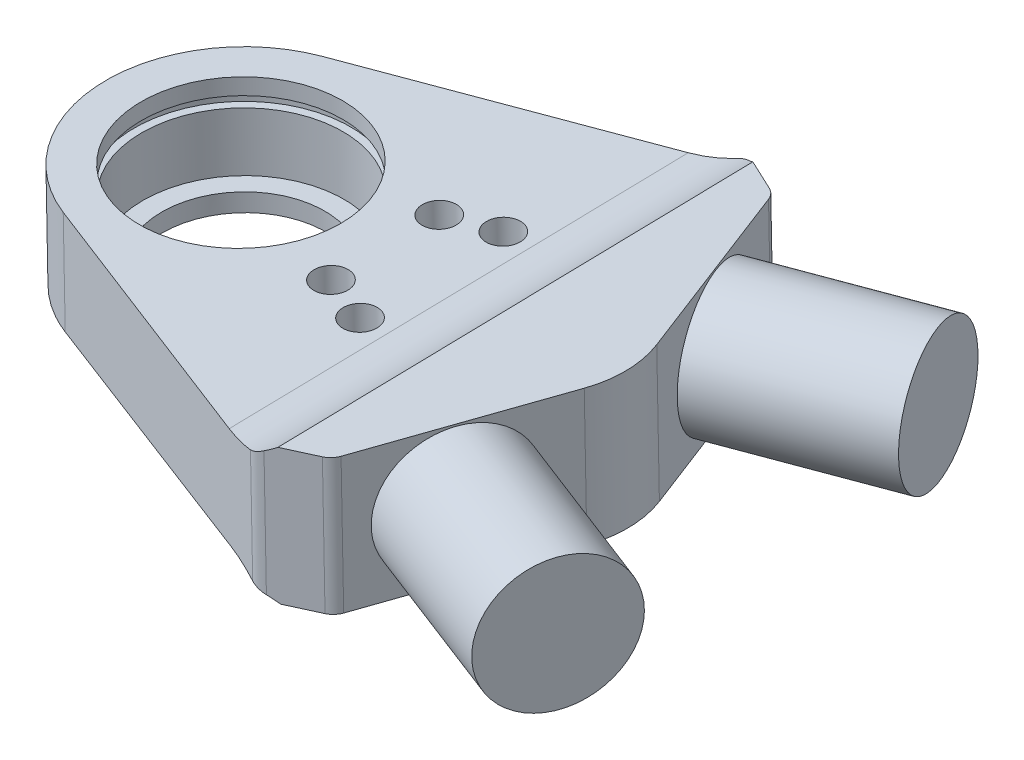
ISO-10303-21;
HEADER;
FILE_DESCRIPTION(('STEP AP214'),'2;1');
FILE_NAME('part.step','',(''),(''),'','','');
FILE_SCHEMA(('AUTOMOTIVE_DESIGN { 1 0 10303 214 1 1 1 1 }'));
ENDSEC;
DATA;
#1=APPLICATION_CONTEXT('core data for automotive mechanical design processes');
#2=APPLICATION_PROTOCOL_DEFINITION('international standard','automotive_design',2000,#1);
#3=PRODUCT_CONTEXT('',#1,'mechanical');
#4=PRODUCT('Part','Part','',(#3));
#5=PRODUCT_RELATED_PRODUCT_CATEGORY('part','',(#4));
#6=PRODUCT_DEFINITION_FORMATION('','',#4);
#7=PRODUCT_DEFINITION_CONTEXT('part definition',#1,'design');
#8=PRODUCT_DEFINITION('design','',#6,#7);
#9=PRODUCT_DEFINITION_SHAPE('','',#8);
#10=(LENGTH_UNIT() NAMED_UNIT(*) SI_UNIT(.MILLI.,.METRE.));
#11=(NAMED_UNIT(*) PLANE_ANGLE_UNIT() SI_UNIT($,.RADIAN.));
#12=(NAMED_UNIT(*) SI_UNIT($,.STERADIAN.) SOLID_ANGLE_UNIT());
#13=UNCERTAINTY_MEASURE_WITH_UNIT(LENGTH_MEASURE(1.E-05),#10,'distance_accuracy_value','');
#14=(GEOMETRIC_REPRESENTATION_CONTEXT(3) GLOBAL_UNCERTAINTY_ASSIGNED_CONTEXT((#13)) GLOBAL_UNIT_ASSIGNED_CONTEXT((#10,
#11,#12)) REPRESENTATION_CONTEXT('',''));
#15=CARTESIAN_POINT('',(0.,0.,0.));
#16=DIRECTION('',(0.,0.,1.));
#17=DIRECTION('',(1.,0.,0.));
#18=AXIS2_PLACEMENT_3D('',#15,#16,#17);
#19=CARTESIAN_POINT('',(-585.53416326074,112.85200121076,771.01929436932));
#20=DIRECTION('',(0.00538004106138572,0.999684848699186,0.024520571760546));
#21=DIRECTION('',(0.,-0.0245209266402855,0.99969931687318));
#22=AXIS2_PLACEMENT_3D('',#19,#20,#21);
#23=CYLINDRICAL_SURFACE('',#22,12.7000000000001);
#24=CARTESIAN_POINT('',(-585.526357552896,114.30240795966,771.054870383916));
#25=DIRECTION('',(0.,0.999699820798355,0.0245003733795452));
#26=DIRECTION('',(0.999992698636837,-9.36243645926273E-05,0.00382019731105017));
#27=AXIS2_PLACEMENT_3D('',#24,#25,#26);
#28=ELLIPSE('',#27,12.7001838064199,12.7000000000001);
#29=CARTESIAN_POINT('',(-590.008326790914,114.011273288213,782.934170113944));
#30=VERTEX_POINT('',#29);
#31=CARTESIAN_POINT('',(-589.917379504176,114.594373365334,759.141673829315));
#32=VERTEX_POINT('',#31);
#33=EDGE_CURVE('E207',#30,#32,#28,.F.);
#34=ORIENTED_EDGE('',*,*,#33,.F.);
#35=DIRECTION('',(0.00538004106138572,0.999684848699186,0.024520571760546));
#36=VECTOR('',#35,1.);
#37=CARTESIAN_POINT('',(-590.016004083219,112.584727894023,782.89917937786));
#38=LINE('',#37,#36);
#39=CARTESIAN_POINT('',(-589.956218253315,123.693748743422,783.171664794921));
#40=VERTEX_POINT('',#39);
#41=EDGE_CURVE('E200',#30,#40,#38,.T.);
#42=ORIENTED_EDGE('',*,*,#41,.T.);
#43=CARTESIAN_POINT('',(-585.474377430836,123.961022060159,771.291779786381));
#44=DIRECTION('',(-0.00538004106137596,-0.999684848699186,-0.0245205717605447));
#45=DIRECTION('',(0.,0.0245209266402842,-0.999699316873179));
#46=AXIS2_PLACEMENT_3D('',#43,#44,#45);
#47=CIRCLE('',#46,12.7000000000001);
#48=CARTESIAN_POINT('',(-589.865270966578,124.276848820543,759.379168510292));
#49=VERTEX_POINT('',#48);
#50=EDGE_CURVE('E181',#49,#40,#47,.F.);
#51=ORIENTED_EDGE('',*,*,#50,.F.);
#52=DIRECTION('',(0.00538004106138572,0.999684848699186,0.024520571760546));
#53=VECTOR('',#52,1.);
#54=CARTESIAN_POINT('',(-589.925056796482,113.167827971144,759.106683093231));
#55=LINE('',#54,#53);
#56=EDGE_CURVE('E208',#32,#49,#55,.T.);
#57=ORIENTED_EDGE('',*,*,#56,.F.);
#58=EDGE_LOOP('',(#34,#42,#51,#57));
#59=FACE_BOUND('',#58,.T.);
#60=ADVANCED_FACE('F64',(#59),#23,.T.);
#61=CARTESIAN_POINT('',(-557.961210133809,113.284714048954,747.328162944679));
#62=DIRECTION('',(-0.3457396484836,0.0248682488491075,-0.938000887881038));
#63=DIRECTION('',(-0.938291066330358,0.,0.345846605946393));
#64=AXIS2_PLACEMENT_3D('',#61,#62,#63);
#65=PLANE('',#64);
#66=CARTESIAN_POINT('',(-565.207646644979,133.888828138748,750.545397264626));
#67=DIRECTION('',(-0.3457396484836,0.0248682488491075,-0.938000887881038));
#68=DIRECTION('',(-0.938315059361521,-0.00343125056869183,0.34576448038357));
#69=AXIS2_PLACEMENT_3D('',#66,#67,#68);
#70=ELLIPSE('',#69,10.1654154875738,9.525);
#71=CARTESIAN_POINT('',(-565.258891536089,124.366829954888,750.311838818607));
#72=VERTEX_POINT('',#71);
#73=CARTESIAN_POINT('',(-562.090502636833,124.918059449398,749.158610110594));
#74=VERTEX_POINT('',#73);
#75=EDGE_CURVE('E245',#72,#74,#70,.F.);
#76=ORIENTED_EDGE('',*,*,#75,.T.);
#77=DIRECTION('',(0.00538004106138572,0.999684848699186,0.0245205717605461));
#78=VECTOR('',#77,1.);
#79=CARTESIAN_POINT('',(-562.153192742071,113.269384717334,748.872887900185));
#80=LINE('',#79,#78);
#81=CARTESIAN_POINT('',(-562.147627690845,114.303446972478,748.898251691349));
#82=VERTEX_POINT('',#81);
#83=EDGE_CURVE('E278',#74,#82,#80,.F.);
#84=ORIENTED_EDGE('',*,*,#83,.T.);
#85=CARTESIAN_POINT('',(-565.318727304473,105.294764034744,749.828255818098));
#86=DIRECTION('',(-0.3457396484836,0.0248682488491075,-0.938000887881038));
#87=DIRECTION('',(-0.938315059361521,-0.00343125056869183,0.34576448038357));
#88=AXIS2_PLACEMENT_3D('',#85,#86,#87);
#89=ELLIPSE('',#88,10.1654154875738,9.525);
#90=CARTESIAN_POINT('',(-565.31880031127,114.816436751554,750.080721003351));
#91=VERTEX_POINT('',#90);
#92=EDGE_CURVE('E241',#82,#91,#89,.F.);
#93=ORIENTED_EDGE('',*,*,#92,.T.);
#94=DIRECTION('',(0.938330258086945,0.00847076544014602,-0.345636475059195));
#95=VECTOR('',#94,1.);
#96=CARTESIAN_POINT('',(-557.960171314262,114.882866688836,747.370150214576));
#97=LINE('',#96,#95);
#98=EDGE_CURVE('E418',#32,#91,#97,.T.);
#99=ORIENTED_EDGE('',*,*,#98,.F.);
#100=ORIENTED_EDGE('',*,*,#56,.T.);
#101=DIRECTION('',(-0.938315059361521,-0.0034312505687005,0.34576448038357));
#102=VECTOR('',#101,1.);
#103=CARTESIAN_POINT('',(-557.901424303906,124.393734898353,747.60064836174));
#104=LINE('',#103,#102);
#105=EDGE_CURVE('E189',#72,#49,#104,.T.);
#106=ORIENTED_EDGE('',*,*,#105,.F.);
#107=EDGE_LOOP('',(#76,#84,#93,#99,#100,#106));
#108=FACE_BOUND('',#107,.T.);
#109=ADVANCED_FACE('F353',(#108),#65,.T.);
#110=CARTESIAN_POINT('',(-549.179423062326,112.653060528187,771.153385496858));
#111=DIRECTION('',(0.938315059361519,0.00343125056869194,-0.345764480383574));
#112=DIRECTION('',(-0.345766515827225,0.,-0.938320583027305));
#113=AXIS2_PLACEMENT_3D('',#110,#111,#112);
#114=PLANE('',#113);
#115=CARTESIAN_POINT('',(-553.536153337328,119.31688607781,759.396479851448));
#116=DIRECTION('',(0.93831505936152,0.00343125056869194,-0.345764480383574));
#117=DIRECTION('',(-0.345766515827225,0.,-0.938320583027305));
#118=AXIS2_PLACEMENT_3D('',#115,#116,#117);
#119=CIRCLE('',#118,6.17219999999994);
#120=CARTESIAN_POINT('',(-555.670293426316,119.31688607781,753.604977548887));
#121=VERTEX_POINT('',#120);
#122=EDGE_CURVE('E235',#121,#121,#119,.T.);
#123=ORIENTED_EDGE('',*,*,#122,.F.);
#124=EDGE_LOOP('',(#123));
#125=FACE_BOUND('',#124,.T.);
#126=DIRECTION('',(-0.345739648483604,0.0248682488491073,-0.938000887881037));
#127=VECTOR('',#126,1.);
#128=CARTESIAN_POINT('',(-549.179423062326,112.653060528187,771.153385496858));
#129=LINE('',#128,#127);
#130=CARTESIAN_POINT('',(-550.40716626778,112.741369241665,767.822485434174));
#131=VERTEX_POINT('',#130);
#132=CARTESIAN_POINT('',(-556.416596116406,113.1736135549,751.518741971736));
#133=VERTEX_POINT('',#132);
#134=EDGE_CURVE('E209',#131,#133,#129,.T.);
#135=ORIENTED_EDGE('',*,*,#134,.T.);
#136=DIRECTION('',(-0.00538004106138572,-0.999684848699186,-0.0245205717605461));
#137=VECTOR('',#136,1.);
#138=CARTESIAN_POINT('',(-556.416596116406,113.1736135549,751.518741971736));
#139=LINE('',#138,#137);
#140=CARTESIAN_POINT('',(-556.348269594927,125.86961113338,751.830153233095));
#141=VERTEX_POINT('',#140);
#142=EDGE_CURVE('E12',#133,#141,#139,.F.);
#143=ORIENTED_EDGE('',*,*,#142,.T.);
#144=DIRECTION('',(-0.345739648483604,0.0248682488491073,-0.938000887881037));
#145=VECTOR('',#144,1.);
#146=CARTESIAN_POINT('',(-549.111096540846,125.349058106666,771.464796758217));
#147=LINE('',#146,#145);
#148=CARTESIAN_POINT('',(-550.338839746301,125.437366820145,768.133896695533));
#149=VERTEX_POINT('',#148);
#150=EDGE_CURVE('E392',#149,#141,#147,.T.);
#151=ORIENTED_EDGE('',*,*,#150,.F.);
#152=DIRECTION('',(0.00538004106138572,0.999684848699186,0.0245205717605461));
#153=VECTOR('',#152,1.);
#154=CARTESIAN_POINT('',(-550.40716626778,112.741369241665,767.822485434174));
#155=LINE('',#154,#153);
#156=EDGE_CURVE('E273',#149,#131,#155,.F.);
#157=ORIENTED_EDGE('',*,*,#156,.T.);
#158=EDGE_LOOP('',(#135,#143,#151,#157));
#159=FACE_BOUND('',#158,.T.);
#160=ADVANCED_FACE('F359',(#125,#159),#114,.T.);
#161=CARTESIAN_POINT('',(-558.143104707284,112.118513894713,794.913155513937));
#162=DIRECTION('',(0.935645255265212,-0.0136859502879864,0.352676411267341));
#163=DIRECTION('',(0.35270944497705,0.,-0.935732893204028));
#164=AXIS2_PLACEMENT_3D('',#161,#162,#163);
#165=PLANE('',#164);
#166=CARTESIAN_POINT('',(-553.627100624065,118.73378600069,783.188976136077));
#167=DIRECTION('',(0.935645255265212,-0.0136859502879864,0.352676411267341));
#168=DIRECTION('',(0.35270944497705,0.,-0.935732893204028));
#169=AXIS2_PLACEMENT_3D('',#166,#167,#168);
#170=CIRCLE('',#169,6.17219999999997);
#171=CARTESIAN_POINT('',(-551.450107387778,118.73378600069,777.413445572643));
#172=VERTEX_POINT('',#171);
#173=EDGE_CURVE('E211',#172,#172,#170,.T.);
#174=ORIENTED_EDGE('',*,*,#173,.F.);
#175=EDGE_LOOP('',(#174));
#176=FACE_BOUND('',#175,.T.);
#177=DIRECTION('',(0.352900852163712,0.0210451430501451,-0.935424016420428));
#178=VECTOR('',#177,1.);
#179=CARTESIAN_POINT('',(-558.074778185804,124.814511473193,795.224566775296));
#180=LINE('',#179,#178);
#181=CARTESIAN_POINT('',(-556.498171032427,124.908531997295,791.045500086488));
#182=VERTEX_POINT('',#181);
#183=CARTESIAN_POINT('',(-550.364269630318,125.274325481985,774.786546188507));
#184=VERTEX_POINT('',#183);
#185=EDGE_CURVE('E219',#182,#184,#180,.T.);
#186=ORIENTED_EDGE('',*,*,#185,.F.);
#187=DIRECTION('',(0.00538004106138572,0.999684848699186,0.0245205717605461));
#188=VECTOR('',#187,1.);
#189=CARTESIAN_POINT('',(-556.566497553907,112.212534418816,790.734088825129));
#190=LINE('',#189,#188);
#191=CARTESIAN_POINT('',(-556.566497553907,112.212534418816,790.734088825129));
#192=VERTEX_POINT('',#191);
#193=EDGE_CURVE('E727',#182,#192,#190,.F.);
#194=ORIENTED_EDGE('',*,*,#193,.T.);
#195=DIRECTION('',(0.352900852163712,0.0210451430501451,-0.935424016420428));
#196=VECTOR('',#195,1.);
#197=CARTESIAN_POINT('',(-558.143104707284,112.118513894713,794.913155513937));
#198=LINE('',#197,#196);
#199=CARTESIAN_POINT('',(-550.432596151798,112.578327903505,774.475134927149));
#200=VERTEX_POINT('',#199);
#201=EDGE_CURVE('E213',#192,#200,#198,.T.);
#202=ORIENTED_EDGE('',*,*,#201,.T.);
#203=DIRECTION('',(0.00538004106138572,0.999684848699186,0.0245205717605461));
#204=VECTOR('',#203,1.);
#205=CARTESIAN_POINT('',(-550.432596151798,112.578327903505,774.475134927149));
#206=LINE('',#205,#204);
#207=EDGE_CURVE('E268',#200,#184,#206,.T.);
#208=ORIENTED_EDGE('',*,*,#207,.T.);
#209=EDGE_LOOP('',(#186,#194,#202,#208));
#210=FACE_BOUND('',#209,.T.);
#211=ADVANCED_FACE('F365',(#176,#210),#165,.T.);
#212=CARTESIAN_POINT('',(-590.016004083219,112.584727894023,782.89917937786));
#213=DIRECTION('',(-0.352900852163713,-0.0210451430501446,0.935424016420427));
#214=DIRECTION('',(0.935631233989688,0.,0.352979027681437));
#215=AXIS2_PLACEMENT_3D('',#212,#213,#214);
#216=PLANE('',#215);
#217=CARTESIAN_POINT('',(-565.479809345375,104.26200149897,791.968532863944));
#218=DIRECTION('',(-0.352900852163713,-0.0210451430501446,0.935424016420427));
#219=DIRECTION('',(0.935645255265212,-0.0136859502879864,0.352676411267343));
#220=AXIS2_PLACEMENT_3D('',#217,#218,#219);
#221=ELLIPSE('',#220,10.1654154875739,9.525);
#222=CARTESIAN_POINT('',(-565.479736338578,113.784610368368,792.182799791572));
#223=VERTEX_POINT('',#222);
#224=CARTESIAN_POINT('',(-562.317594743571,113.213719009083,793.362914855799));
#225=VERTEX_POINT('',#224);
#226=EDGE_CURVE('E243',#223,#225,#221,.F.);
#227=ORIENTED_EDGE('',*,*,#226,.T.);
#228=DIRECTION('',(-0.00538004106138572,-0.999684848699186,-0.0245205717605461));
#229=VECTOR('',#228,1.);
#230=CARTESIAN_POINT('',(-562.323159794797,112.17965675394,793.337551064635));
#231=LINE('',#230,#229);
#232=CARTESIAN_POINT('',(-562.26046968956,123.828331486004,793.623273275044));
#233=VERTEX_POINT('',#232);
#234=EDGE_CURVE('E330',#225,#233,#231,.F.);
#235=ORIENTED_EDGE('',*,*,#234,.T.);
#236=CARTESIAN_POINT('',(-565.368606889457,132.856846489425,792.653811447264));
#237=DIRECTION('',(-0.352900852163713,-0.0210451430501446,0.935424016420427));
#238=DIRECTION('',(0.935645255265212,-0.0136859502879864,0.352676411267343));
#239=AXIS2_PLACEMENT_3D('',#236,#237,#238);
#240=ELLIPSE('',#239,10.1654154875739,9.525);
#241=CARTESIAN_POINT('',(-565.419851780567,123.334848305565,792.420253001245));
#242=VERTEX_POINT('',#241);
#243=EDGE_CURVE('E203',#233,#242,#240,.F.);
#244=ORIENTED_EDGE('',*,*,#243,.T.);
#245=DIRECTION('',(0.935645255265212,-0.0136859502879768,0.352676411267343));
#246=VECTOR('',#245,1.);
#247=CARTESIAN_POINT('',(-589.956218253316,123.693748743422,783.171664794921));
#248=LINE('',#247,#246);
#249=EDGE_CURVE('E186',#40,#242,#248,.T.);
#250=ORIENTED_EDGE('',*,*,#249,.F.);
#251=ORIENTED_EDGE('',*,*,#41,.F.);
#252=DIRECTION('',(-0.935660487914937,0.00864621791402423,-0.352795541738505));
#253=VECTOR('',#252,1.);
#254=CARTESIAN_POINT('',(-590.015057644668,114.011335486446,782.931632211331));
#255=LINE('',#254,#253);
#256=EDGE_CURVE('E234',#223,#30,#255,.T.);
#257=ORIENTED_EDGE('',*,*,#256,.F.);
#258=EDGE_LOOP('',(#227,#235,#244,#250,#251,#257));
#259=FACE_BOUND('',#258,.T.);
#260=ADVANCED_FACE('F198',(#259),#216,.T.);
#261=CARTESIAN_POINT('',(-585.53416326074,112.85200121076,771.01929436932));
#262=DIRECTION('',(0.00538004106138572,0.999684848699186,0.0245205717605461));
#263=DIRECTION('',(0.,-0.0245209266402855,0.99969931687318));
#264=AXIS2_PLACEMENT_3D('',#261,#262,#263);
#265=PLANE('',#264);
#266=ORIENTED_EDGE('',*,*,#201,.F.);
#267=CARTESIAN_POINT('',(-558.05183439664,112.234260864898,790.174215022242));
#268=DIRECTION('',(0.00538004106138572,0.999684848699186,0.0245205717605461));
#269=DIRECTION('',(0.,-0.0245209266402855,0.99969931687318));
#270=AXIS2_PLACEMENT_3D('',#267,#268,#269);
#271=CIRCLE('',#270,1.5875);
#272=CARTESIAN_POINT('',(-557.397685147519,112.195274100705,791.620148991029));
#273=VERTEX_POINT('',#272);
#274=EDGE_CURVE('E386',#192,#273,#271,.F.);
#275=ORIENTED_EDGE('',*,*,#274,.T.);
#276=DIRECTION('',(0.911139690434511,0.00520373510618165,-0.412064783323991));
#277=VECTOR('',#276,1.);
#278=CARTESIAN_POINT('',(-561.707913129844,112.17065736531,793.569458387008));
#279=LINE('',#278,#277);
#280=CARTESIAN_POINT('',(-560.217428581383,112.179169876456,792.895383710032));
#281=VERTEX_POINT('',#280);
#282=EDGE_CURVE('E261',#273,#281,#279,.F.);
#283=ORIENTED_EDGE('',*,*,#282,.T.);
#284=DIRECTION('',(0.00382134439891516,0.0245001944934228,-0.99969252162691));
#285=VECTOR('',#284,1.);
#286=CARTESIAN_POINT('',(-560.134164912947,112.713007148883,771.112979935475));
#287=LINE('',#286,#285);
#288=CARTESIAN_POINT('',(-560.050901244511,113.24684442131,749.330576160918));
#289=VERTEX_POINT('',#288);
#290=EDGE_CURVE('E231',#281,#289,#287,.T.);
#291=ORIENTED_EDGE('',*,*,#290,.T.);
#292=DIRECTION('',(-0.907963791331784,0.0151582468523668,-0.418774379807044));
#293=VECTOR('',#292,1.);
#294=CARTESIAN_POINT('',(-556.643942073087,113.189966020839,750.901946327506));
#295=LINE('',#294,#293);
#296=CARTESIAN_POINT('',(-557.240986403051,113.199933538731,750.626575358548));
#297=VERTEX_POINT('',#296);
#298=EDGE_CURVE('E259',#289,#297,#295,.F.);
#299=ORIENTED_EDGE('',*,*,#298,.T.);
#300=CARTESIAN_POINT('',(-557.906171273143,113.168166444622,752.067643084345));
#301=DIRECTION('',(0.00538004106138572,0.999684848699186,0.0245205717605461));
#302=DIRECTION('',(0.,-0.0245209266402855,0.99969931687318));
#303=AXIS2_PLACEMENT_3D('',#300,#301,#302);
#304=CIRCLE('',#303,1.5875);
#305=EDGE_CURVE('E88',#297,#133,#304,.F.);
#306=ORIENTED_EDGE('',*,*,#305,.T.);
#307=ORIENTED_EDGE('',*,*,#134,.F.);
#308=CARTESIAN_POINT('',(-559.344617208199,112.708686579998,771.115892109827));
#309=DIRECTION('',(0.00538004106138572,0.999684848699186,0.0245205717605461));
#310=DIRECTION('',(0.,-0.0245209266402855,0.99969931687318));
#311=AXIS2_PLACEMENT_3D('',#308,#309,#310);
#312=CIRCLE('',#311,9.525);
#313=EDGE_CURVE('E275',#131,#200,#312,.F.);
#314=ORIENTED_EDGE('',*,*,#313,.T.);
#315=EDGE_LOOP('',(#266,#275,#283,#291,#299,#306,#307,#314));
#316=FACE_BOUND('',#315,.T.);
#317=ADVANCED_FACE('F369',(#316),#265,.F.);
#318=CARTESIAN_POINT('',(-585.46583673926,125.54799878924,771.330705630679));
#319=DIRECTION('',(0.00538004106138572,0.999684848699186,0.0245205717605461));
#320=DIRECTION('',(0.,-0.0245209266402855,0.99969931687318));
#321=AXIS2_PLACEMENT_3D('',#318,#319,#320);
#322=PLANE('',#321);
#323=DIRECTION('',(-0.911139690434511,-0.00520373510618165,0.412064783323991));
#324=VECTOR('',#323,1.);
#325=CARTESIAN_POINT('',(-572.949899054353,124.802059063976,798.995981520138));
#326=LINE('',#325,#324);
#327=CARTESIAN_POINT('',(-560.149102059903,124.875167454936,793.206794971391));
#328=VERTEX_POINT('',#327);
#329=CARTESIAN_POINT('',(-557.329358626039,124.891271679185,791.931560252388));
#330=VERTEX_POINT('',#329);
#331=EDGE_CURVE('E256',#328,#330,#326,.F.);
#332=ORIENTED_EDGE('',*,*,#331,.T.);
#333=CARTESIAN_POINT('',(-557.983507875161,124.930258443377,790.485626283601));
#334=DIRECTION('',(0.00538004106138572,0.999684848699186,0.0245205717605461));
#335=DIRECTION('',(0.,-0.0245209266402855,0.99969931687318));
#336=AXIS2_PLACEMENT_3D('',#333,#334,#335);
#337=CIRCLE('',#336,1.5875);
#338=EDGE_CURVE('E73',#330,#182,#337,.T.);
#339=ORIENTED_EDGE('',*,*,#338,.T.);
#340=ORIENTED_EDGE('',*,*,#185,.T.);
#341=CARTESIAN_POINT('',(-559.276290686719,125.404684158478,771.427303371186));
#342=DIRECTION('',(0.00538004106138572,0.999684848699186,0.0245205717605461));
#343=DIRECTION('',(0.,-0.0245209266402855,0.99969931687318));
#344=AXIS2_PLACEMENT_3D('',#341,#342,#343);
#345=CIRCLE('',#344,9.525);
#346=EDGE_CURVE('E271',#184,#149,#345,.T.);
#347=ORIENTED_EDGE('',*,*,#346,.T.);
#348=ORIENTED_EDGE('',*,*,#150,.T.);
#349=CARTESIAN_POINT('',(-557.837844751663,125.864164023102,752.379054345703));
#350=DIRECTION('',(0.00538004106138572,0.999684848699186,0.0245205717605461));
#351=DIRECTION('',(0.,-0.0245209266402855,0.99969931687318));
#352=AXIS2_PLACEMENT_3D('',#349,#350,#351);
#353=CIRCLE('',#352,1.5875);
#354=CARTESIAN_POINT('',(-557.172659881572,125.895931117211,750.937986619907));
#355=VERTEX_POINT('',#354);
#356=EDGE_CURVE('E81',#141,#355,#353,.T.);
#357=ORIENTED_EDGE('',*,*,#356,.T.);
#358=DIRECTION('',(0.907963791331784,-0.0151582468523668,0.418774379807044));
#359=VECTOR('',#358,1.);
#360=CARTESIAN_POINT('',(-572.738752829603,126.155803461995,743.758536313007));
#361=LINE('',#360,#359);
#362=CARTESIAN_POINT('',(-559.982574723031,125.94284199979,749.641987422277));
#363=VERTEX_POINT('',#362);
#364=EDGE_CURVE('E254',#355,#363,#361,.F.);
#365=ORIENTED_EDGE('',*,*,#364,.T.);
#366=DIRECTION('',(0.00382134439891516,0.0245001944934215,-0.99969252162691));
#367=VECTOR('',#366,1.);
#368=CARTESIAN_POINT('',(-560.158560755916,124.814523904451,795.681261201484));
#369=LINE('',#368,#367);
#370=EDGE_CURVE('E230',#328,#363,#369,.T.);
#371=ORIENTED_EDGE('',*,*,#370,.F.);
#372=EDGE_LOOP('',(#332,#339,#340,#347,#348,#357,#365,#371));
#373=FACE_BOUND('',#372,.T.);
#374=ADVANCED_FACE('F378',(#373),#322,.T.);
#375=CARTESIAN_POINT('',(-538.77373219673,118.516521539868,788.787714164946));
#376=DIRECTION('',(-0.935645255265212,0.0136859502879864,-0.352676411267341));
#377=DIRECTION('',(-0.35270944497705,0.,0.935732893204028));
#378=AXIS2_PLACEMENT_3D('',#375,#376,#377);
#379=CYLINDRICAL_SURFACE('',#378,6.17219999999997);
#380=CARTESIAN_POINT('',(-538.77373219673,118.516521539868,788.787714164946));
#381=DIRECTION('',(0.935645255265212,-0.0136859502879864,0.352676411267341));
#382=DIRECTION('',(0.35270944497705,0.,-0.935732893204028));
#383=AXIS2_PLACEMENT_3D('',#380,#381,#382);
#384=CIRCLE('',#383,6.17219999999997);
#385=CARTESIAN_POINT('',(-536.596738960443,118.516521539868,783.012183601512));
#386=VERTEX_POINT('',#385);
#387=EDGE_CURVE('E403',#386,#386,#384,.T.);
#388=ORIENTED_EDGE('',*,*,#387,.F.);
#389=EDGE_LOOP('',(#388));
#390=FACE_BOUND('',#389,.T.);
#391=ORIENTED_EDGE('',*,*,#173,.T.);
#392=EDGE_LOOP('',(#391));
#393=FACE_BOUND('',#392,.T.);
#394=ADVANCED_FACE('F382',(#390,#393),#379,.T.);
#395=CARTESIAN_POINT('',(-538.77373219673,118.516521539868,788.787714164946));
#396=DIRECTION('',(0.935645255265212,-0.0136859502879864,0.352676411267341));
#397=DIRECTION('',(0.35270944497705,0.,-0.935732893204028));
#398=AXIS2_PLACEMENT_3D('',#395,#396,#397);
#399=PLANE('',#398);
#400=ORIENTED_EDGE('',*,*,#387,.T.);
#401=EDGE_LOOP('',(#400));
#402=FACE_BOUND('',#401,.T.);
#403=ADVANCED_FACE('F490',(#402),#399,.T.);
#404=CARTESIAN_POINT('',(-538.640401769963,119.371357180588,753.907468725359));
#405=DIRECTION('',(-0.93831505936152,-0.00343125056869194,0.345764480383574));
#406=DIRECTION('',(0.345766515827225,0.,0.938320583027305));
#407=AXIS2_PLACEMENT_3D('',#404,#405,#406);
#408=CYLINDRICAL_SURFACE('',#407,6.17219999999994);
#409=CARTESIAN_POINT('',(-538.640401769963,119.371357180588,753.907468725359));
#410=DIRECTION('',(0.93831505936152,0.00343125056869194,-0.345764480383574));
#411=DIRECTION('',(-0.345766515827225,0.,-0.938320583027305));
#412=AXIS2_PLACEMENT_3D('',#409,#410,#411);
#413=CIRCLE('',#412,6.17219999999994);
#414=CARTESIAN_POINT('',(-540.774541858952,119.371357180588,748.115966422798));
#415=VERTEX_POINT('',#414);
#416=EDGE_CURVE('E410',#415,#415,#413,.T.);
#417=ORIENTED_EDGE('',*,*,#416,.F.);
#418=EDGE_LOOP('',(#417));
#419=FACE_BOUND('',#418,.T.);
#420=ORIENTED_EDGE('',*,*,#122,.T.);
#421=EDGE_LOOP('',(#420));
#422=FACE_BOUND('',#421,.T.);
#423=ADVANCED_FACE('F486',(#419,#422),#408,.T.);
#424=CARTESIAN_POINT('',(-538.640401769963,119.371357180588,753.907468725359));
#425=DIRECTION('',(0.93831505936152,0.00343125056869194,-0.345764480383574));
#426=DIRECTION('',(-0.345766515827225,0.,-0.938320583027305));
#427=AXIS2_PLACEMENT_3D('',#424,#425,#426);
#428=PLANE('',#427);
#429=ORIENTED_EDGE('',*,*,#416,.T.);
#430=EDGE_LOOP('',(#429));
#431=FACE_BOUND('',#430,.T.);
#432=ADVANCED_FACE('F445',(#431),#428,.T.);
#433=CARTESIAN_POINT('',(-598.266823265556,123.436036759479,795.501808024861));
#434=DIRECTION('',(-0.00538004106137596,-0.999684848699186,-0.0245205717605447));
#435=DIRECTION('',(0.,0.0245209266402842,-0.999699316873179));
#436=AXIS2_PLACEMENT_3D('',#433,#434,#435);
#437=PLANE('',#436);
#438=CARTESIAN_POINT('',(-572.126615288895,124.009832442113,766.373195143359));
#439=DIRECTION('',(0.00538004106137596,0.999684848699186,0.0245205717605447));
#440=DIRECTION('',(0.,-0.0245209266402842,0.999699316873179));
#441=AXIS2_PLACEMENT_3D('',#438,#439,#440);
#442=CIRCLE('',#441,1.58750000000021);
#443=CARTESIAN_POINT('',(-572.126615288895,123.970905471072,767.960217808896));
#444=VERTEX_POINT('',#443);
#445=EDGE_CURVE('E430',#444,#444,#442,.T.);
#446=ORIENTED_EDGE('',*,*,#445,.F.);
#447=EDGE_LOOP('',(#446));
#448=FACE_BOUND('',#447,.T.);
#449=CARTESIAN_POINT('',(-572.16459390779,123.766336056447,776.308688343591));
#450=DIRECTION('',(0.00538004106137596,0.999684848699186,0.0245205717605447));
#451=DIRECTION('',(0.,-0.0245209266402842,0.999699316873179));
#452=AXIS2_PLACEMENT_3D('',#449,#450,#451);
#453=CIRCLE('',#452,1.58749999999983);
#454=CARTESIAN_POINT('',(-572.16459390779,123.727409085405,777.895711009127));
#455=VERTEX_POINT('',#454);
#456=EDGE_CURVE('E433',#455,#455,#453,.T.);
#457=ORIENTED_EDGE('',*,*,#456,.F.);
#458=EDGE_LOOP('',(#457));
#459=FACE_BOUND('',#458,.T.);
#460=CARTESIAN_POINT('',(-567.867448559226,123.703480484541,777.928428081166));
#461=DIRECTION('',(0.00538004106137596,0.999684848699186,0.0245205717605447));
#462=DIRECTION('',(0.,-0.0245209266402842,0.999699316873179));
#463=AXIS2_PLACEMENT_3D('',#460,#461,#462);
#464=CIRCLE('',#463,1.58749999999986);
#465=CARTESIAN_POINT('',(-567.867448559226,123.664553513499,779.515450746702));
#466=VERTEX_POINT('',#465);
#467=EDGE_CURVE('E429',#466,#466,#464,.T.);
#468=ORIENTED_EDGE('',*,*,#467,.F.);
#469=EDGE_LOOP('',(#468));
#470=FACE_BOUND('',#469,.T.);
#471=CARTESIAN_POINT('',(-567.817208309985,124.025591173681,764.785199885308));
#472=DIRECTION('',(0.00538004106137596,0.999684848699186,0.0245205717605447));
#473=DIRECTION('',(0.,-0.0245209266402842,0.999699316873179));
#474=AXIS2_PLACEMENT_3D('',#471,#472,#473);
#475=CIRCLE('',#474,1.5874999999999);
#476=CARTESIAN_POINT('',(-567.817208309985,123.98666420264,766.372222550845));
#477=VERTEX_POINT('',#476);
#478=EDGE_CURVE('E425',#477,#477,#475,.T.);
#479=ORIENTED_EDGE('',*,*,#478,.F.);
#480=EDGE_LOOP('',(#479));
#481=FACE_BOUND('',#480,.T.);
#482=ORIENTED_EDGE('',*,*,#249,.T.);
#483=DIRECTION('',(-0.00382134439891515,-0.0245001944934215,0.99969252162691));
#484=VECTOR('',#483,1.);
#485=CARTESIAN_POINT('',(-565.432094022777,123.256358307315,795.622915914575));
#486=LINE('',#485,#484);
#487=EDGE_CURVE('E239',#242,#72,#486,.F.);
#488=ORIENTED_EDGE('',*,*,#487,.T.);
#489=ORIENTED_EDGE('',*,*,#105,.T.);
#490=ORIENTED_EDGE('',*,*,#50,.T.);
#491=EDGE_LOOP('',(#482,#488,#489,#490));
#492=FACE_BOUND('',#491,.T.);
#493=CARTESIAN_POINT('',(-585.474377430836,123.961022060159,771.291779786381));
#494=DIRECTION('',(-0.00538004106137596,-0.999684848699186,-0.0245205717605447));
#495=DIRECTION('',(0.,0.0245209266402842,-0.999699316873179));
#496=AXIS2_PLACEMENT_3D('',#493,#494,#495);
#497=CIRCLE('',#496,9.39800000000015);
#498=CARTESIAN_POINT('',(-585.474377430836,124.191469728725,761.896605606407));
#499=VERTEX_POINT('',#498);
#500=EDGE_CURVE('E204',#499,#499,#497,.T.);
#501=ORIENTED_EDGE('',*,*,#500,.T.);
#502=EDGE_LOOP('',(#501));
#503=FACE_BOUND('',#502,.T.);
#504=ADVANCED_FACE('F183',(#448,#459,#470,#481,#492,#503),#437,.F.);
#505=CARTESIAN_POINT('',(-598.319170995111,113.709116183387,795.263223180542));
#506=DIRECTION('',(0.,0.999699820798355,0.0245003733795452));
#507=DIRECTION('',(0.,-0.0245003733795452,0.999699820798355));
#508=AXIS2_PLACEMENT_3D('',#505,#506,#507);
#509=PLANE('',#508);
#510=CARTESIAN_POINT('',(-572.178209594932,114.422908209372,766.138044171613));
#511=DIRECTION('',(0.,0.999699820798355,0.0245003733795452));
#512=DIRECTION('',(0.999992698636837,-9.36243645865721E-05,0.00382019731080309));
#513=AXIS2_PLACEMENT_3D('',#510,#511,#512);
#514=ELLIPSE('',#513,1.58752297580269,1.58750000000021);
#515=CARTESIAN_POINT('',(-570.590698210211,114.422759578542,766.144108822616));
#516=VERTEX_POINT('',#515);
#517=EDGE_CURVE('E68',#516,#516,#514,.T.);
#518=ORIENTED_EDGE('',*,*,#517,.T.);
#519=EDGE_LOOP('',(#518));
#520=FACE_BOUND('',#519,.T.);
#521=CARTESIAN_POINT('',(-572.216188213827,114.179411823706,776.073537371845));
#522=DIRECTION('',(0.,0.999699820798355,0.0245003733795452));
#523=DIRECTION('',(0.999992698636837,-9.36243645865721E-05,0.00382019731080309));
#524=AXIS2_PLACEMENT_3D('',#521,#522,#523);
#525=ELLIPSE('',#524,1.58752297580231,1.58749999999983);
#526=CARTESIAN_POINT('',(-570.628676829107,114.179263192876,776.079602022848));
#527=VERTEX_POINT('',#526);
#528=EDGE_CURVE('E460',#527,#527,#525,.T.);
#529=ORIENTED_EDGE('',*,*,#528,.T.);
#530=EDGE_LOOP('',(#529));
#531=FACE_BOUND('',#530,.T.);
#532=CARTESIAN_POINT('',(-567.91891830219,114.139701765868,777.693844829576));
#533=DIRECTION('',(0.,0.999699820798355,0.0245003733795452));
#534=DIRECTION('',(0.999992698636837,-9.36243645865721E-05,0.00382019731080309));
#535=AXIS2_PLACEMENT_3D('',#532,#533,#534);
#536=ELLIPSE('',#535,1.58752297580234,1.58749999999986);
#537=CARTESIAN_POINT('',(-566.33140691747,114.139553135039,777.699909480579));
#538=VERTEX_POINT('',#537);
#539=EDGE_CURVE('E457',#538,#538,#536,.T.);
#540=ORIENTED_EDGE('',*,*,#539,.T.);
#541=EDGE_LOOP('',(#540));
#542=FACE_BOUND('',#541,.T.);
#543=CARTESIAN_POINT('',(-567.86867805295,114.461812455009,764.550616633718));
#544=DIRECTION('',(0.,0.999699820798355,0.0245003733795452));
#545=DIRECTION('',(0.999992698636837,-9.36243645865721E-05,0.00382019731080309));
#546=AXIS2_PLACEMENT_3D('',#543,#544,#545);
#547=ELLIPSE('',#546,1.58752297580238,1.5874999999999);
#548=CARTESIAN_POINT('',(-566.28116666823,114.461663824179,764.556681284721));
#549=VERTEX_POINT('',#548);
#550=EDGE_CURVE('E428',#549,#549,#547,.T.);
#551=ORIENTED_EDGE('',*,*,#550,.T.);
#552=EDGE_LOOP('',(#551));
#553=FACE_BOUND('',#552,.T.);
#554=ORIENTED_EDGE('',*,*,#98,.T.);
#555=DIRECTION('',(-0.00382134439891516,-0.0245001944934215,0.99969252162691));
#556=VECTOR('',#555,1.);
#557=CARTESIAN_POINT('',(-565.491990689373,113.706042737049,795.388630402111));
#558=LINE('',#557,#556);
#559=EDGE_CURVE('E237',#91,#223,#558,.T.);
#560=ORIENTED_EDGE('',*,*,#559,.T.);
#561=ORIENTED_EDGE('',*,*,#256,.T.);
#562=ORIENTED_EDGE('',*,*,#33,.T.);
#563=EDGE_LOOP('',(#554,#560,#561,#562));
#564=FACE_BOUND('',#563,.T.);
#565=CARTESIAN_POINT('',(-585.526357552896,114.30240795966,771.054870383916));
#566=DIRECTION('',(0.,0.999699820798355,0.0245003733795452));
#567=DIRECTION('',(0.999992698636837,-9.36243645926273E-05,0.00382019731105017));
#568=AXIS2_PLACEMENT_3D('',#565,#566,#567);
#569=ELLIPSE('',#568,7.62011028385188,7.61999999999998);
#570=CARTESIAN_POINT('',(-577.906302906237,114.301694531676,771.083980708732));
#571=VERTEX_POINT('',#570);
#572=EDGE_CURVE('E415',#571,#571,#569,.F.);
#573=ORIENTED_EDGE('',*,*,#572,.F.);
#574=EDGE_LOOP('',(#573));
#575=FACE_BOUND('',#574,.T.);
#576=ADVANCED_FACE('F444',(#520,#531,#542,#553,#564,#575),#509,.F.);
#577=CARTESIAN_POINT('',(-585.459305059521,126.761673777464,771.360475017183));
#578=DIRECTION('',(-0.00538004106138572,-0.999684848699186,-0.0245205717605461));
#579=DIRECTION('',(0.,0.0245209266402855,-0.999699316873179));
#580=AXIS2_PLACEMENT_3D('',#577,#578,#579);
#581=CYLINDRICAL_SURFACE('',#580,9.39800000000015);
#582=CARTESIAN_POINT('',(-585.517423262977,115.962520617488,771.095590128353));
#583=DIRECTION('',(0.00538004106138572,0.999684848699186,0.0245205717605461));
#584=DIRECTION('',(0.,-0.0245209266402855,0.99969931687318));
#585=AXIS2_PLACEMENT_3D('',#582,#583,#584);
#586=CIRCLE('',#585,9.39800000000015);
#587=CARTESIAN_POINT('',(-585.517423262977,115.732072948922,780.490764308328));
#588=VERTEX_POINT('',#587);
#589=EDGE_CURVE('E220',#588,#588,#586,.T.);
#590=ORIENTED_EDGE('',*,*,#589,.F.);
#591=EDGE_LOOP('',(#590));
#592=FACE_BOUND('',#591,.T.);
#593=CARTESIAN_POINT('',(-585.487906205698,121.447191571391,771.230119793261));
#594=DIRECTION('',(0.00538004106138572,0.999684848699186,0.0245205717605461));
#595=DIRECTION('',(0.,-0.0245209266402855,0.99969931687318));
#596=AXIS2_PLACEMENT_3D('',#593,#594,#595);
#597=CIRCLE('',#596,9.39800000000015);
#598=CARTESIAN_POINT('',(-585.487906205698,121.216743902826,780.625293973235));
#599=VERTEX_POINT('',#598);
#600=EDGE_CURVE('E224',#599,#599,#597,.T.);
#601=ORIENTED_EDGE('',*,*,#600,.T.);
#602=EDGE_LOOP('',(#601));
#603=FACE_BOUND('',#602,.T.);
#604=ADVANCED_FACE('F483',(#592,#603),#581,.F.);
#605=CARTESIAN_POINT('',(-585.517423262977,115.962520617488,771.095590128353));
#606=DIRECTION('',(0.00538004106138572,0.999684848699186,0.0245205717605461));
#607=DIRECTION('',(0.,-0.0245209266402855,0.99969931687318));
#608=AXIS2_PLACEMENT_3D('',#605,#606,#607);
#609=PLANE('',#608);
#610=ORIENTED_EDGE('',*,*,#589,.T.);
#611=EDGE_LOOP('',(#610));
#612=FACE_BOUND('',#611,.T.);
#613=CARTESIAN_POINT('',(-585.517423262977,115.962520617488,771.095590128353));
#614=DIRECTION('',(0.00538004106138572,0.999684848699186,0.0245205717605461));
#615=DIRECTION('',(0.,-0.0245209266402855,0.99969931687318));
#616=AXIS2_PLACEMENT_3D('',#613,#614,#615);
#617=CIRCLE('',#616,7.61999999999998);
#618=CARTESIAN_POINT('',(-585.517423262977,115.775671156489,778.713298922927));
#619=VERTEX_POINT('',#618);
#620=EDGE_CURVE('E216',#619,#619,#617,.F.);
#621=ORIENTED_EDGE('',*,*,#620,.T.);
#622=EDGE_LOOP('',(#621));
#623=FACE_BOUND('',#622,.T.);
#624=ADVANCED_FACE('F511',(#612,#623),#609,.T.);
#625=CARTESIAN_POINT('',(-585.53416326074,112.85200121076,771.019294369321));
#626=DIRECTION('',(0.00538004106138572,0.999684848699186,0.024520571760546));
#627=DIRECTION('',(0.,-0.0245209266402855,0.99969931687318));
#628=AXIS2_PLACEMENT_3D('',#625,#626,#627);
#629=CYLINDRICAL_SURFACE('',#628,7.61999999999998);
#630=ORIENTED_EDGE('',*,*,#572,.T.);
#631=EDGE_LOOP('',(#630));
#632=FACE_BOUND('',#631,.T.);
#633=ORIENTED_EDGE('',*,*,#620,.F.);
#634=EDGE_LOOP('',(#633));
#635=FACE_BOUND('',#634,.T.);
#636=ADVANCED_FACE('F502',(#632,#635),#629,.F.);
#637=CARTESIAN_POINT('',(-585.487906205698,121.447191571391,771.230119793261));
#638=DIRECTION('',(0.00538004106138572,0.999684848699186,0.0245205717605461));
#639=DIRECTION('',(0.,-0.0245209266402855,0.99969931687318));
#640=AXIS2_PLACEMENT_3D('',#637,#638,#639);
#641=PLANE('',#640);
#642=ORIENTED_EDGE('',*,*,#600,.F.);
#643=EDGE_LOOP('',(#642));
#644=FACE_BOUND('',#643,.T.);
#645=CARTESIAN_POINT('',(-585.487906205698,121.447191571391,771.230119793261));
#646=DIRECTION('',(0.00538004106138572,0.999684848699186,0.0245205717605461));
#647=DIRECTION('',(0.,-0.0245209266402855,0.99969931687318));
#648=AXIS2_PLACEMENT_3D('',#645,#646,#647);
#649=CIRCLE('',#648,10.1092000000001);
#650=CARTESIAN_POINT('',(-585.487906205698,121.199304619799,781.336280127395));
#651=VERTEX_POINT('',#650);
#652=EDGE_CURVE('E225',#651,#651,#649,.T.);
#653=ORIENTED_EDGE('',*,*,#652,.T.);
#654=EDGE_LOOP('',(#653));
#655=FACE_BOUND('',#654,.T.);
#656=ADVANCED_FACE('F498',(#644,#655),#641,.T.);
#657=CARTESIAN_POINT('',(-585.487906205698,121.447191571391,771.230119793261));
#658=DIRECTION('',(0.00538004106138572,0.999684848699186,0.0245205717605461));
#659=DIRECTION('',(0.,-0.0245209266402855,0.99969931687318));
#660=AXIS2_PLACEMENT_3D('',#657,#658,#659);
#661=CYLINDRICAL_SURFACE('',#660,10.1092000000001);
#662=ORIENTED_EDGE('',*,*,#652,.F.);
#663=EDGE_LOOP('',(#662));
#664=FACE_BOUND('',#663,.T.);
#665=CARTESIAN_POINT('',(-585.482576737023,122.437479382512,771.254409871647));
#666=DIRECTION('',(0.00538004106138572,0.999684848699186,0.0245205717605461));
#667=DIRECTION('',(0.,-0.0245209266402855,0.99969931687318));
#668=AXIS2_PLACEMENT_3D('',#665,#666,#667);
#669=CIRCLE('',#668,10.1092000000001);
#670=CARTESIAN_POINT('',(-585.482576737023,122.18959243092,781.360570205781));
#671=VERTEX_POINT('',#670);
#672=EDGE_CURVE('E400',#671,#671,#669,.T.);
#673=ORIENTED_EDGE('',*,*,#672,.T.);
#674=EDGE_LOOP('',(#673));
#675=FACE_BOUND('',#674,.T.);
#676=ADVANCED_FACE('F501',(#664,#675),#661,.F.);
#677=CARTESIAN_POINT('',(-585.482576737023,122.437479382512,771.254409871647));
#678=DIRECTION('',(0.00538004106138572,0.999684848699186,0.0245205717605461));
#679=DIRECTION('',(0.,-0.0245209266402855,0.99969931687318));
#680=AXIS2_PLACEMENT_3D('',#677,#678,#679);
#681=PLANE('',#680);
#682=CARTESIAN_POINT('',(-585.482576737023,122.437479382512,771.254409871647));
#683=DIRECTION('',(0.00538004106138572,0.999684848699186,0.0245205717605461));
#684=DIRECTION('',(0.,-0.0245209266402855,0.99969931687318));
#685=AXIS2_PLACEMENT_3D('',#682,#683,#684);
#686=CIRCLE('',#685,9.39800000000015);
#687=CARTESIAN_POINT('',(-585.482576737023,122.207031713947,780.649584051621));
#688=VERTEX_POINT('',#687);
#689=EDGE_CURVE('E221',#688,#688,#686,.T.);
#690=ORIENTED_EDGE('',*,*,#689,.T.);
#691=EDGE_LOOP('',(#690));
#692=FACE_BOUND('',#691,.T.);
#693=ORIENTED_EDGE('',*,*,#672,.F.);
#694=EDGE_LOOP('',(#693));
#695=FACE_BOUND('',#694,.T.);
#696=ADVANCED_FACE('F504',(#692,#695),#681,.F.);
#697=ORIENTED_EDGE('',*,*,#500,.F.);
#698=EDGE_LOOP('',(#697));
#699=FACE_BOUND('',#698,.T.);
#700=ORIENTED_EDGE('',*,*,#689,.F.);
#701=EDGE_LOOP('',(#700));
#702=FACE_BOUND('',#701,.T.);
#703=ADVANCED_FACE('F304',(#699,#702),#581,.F.);
#704=CARTESIAN_POINT('',(-565.491990689373,104.183901943945,795.15526434567));
#705=DIRECTION('',(-0.00382134439891516,-0.0245001944934228,0.99969252162691));
#706=DIRECTION('',(0.,-0.999699820798355,-0.0245003733795465));
#707=AXIS2_PLACEMENT_3D('',#704,#705,#706);
#708=CYLINDRICAL_SURFACE('',#707,9.525);
#709=ORIENTED_EDGE('',*,*,#92,.F.);
#710=CARTESIAN_POINT('',(-562.147627690845,114.303446972478,748.898251691349));
#711=CARTESIAN_POINT('',(-562.102930598252,114.288124288514,748.881370544944));
#712=CARTESIAN_POINT('',(-562.057696504777,114.272179339812,748.866570161626));
#713=CARTESIAN_POINT('',(-561.966511340125,114.239125976082,748.841129106333));
#714=CARTESIAN_POINT('',(-561.920560578421,114.222018053086,748.830486687902));
#715=CARTESIAN_POINT('',(-561.782309055191,114.16912688491,748.804811759424));
#716=CARTESIAN_POINT('',(-561.689414539444,114.131709905043,748.795959313789));
#717=CARTESIAN_POINT('',(-561.505126470233,114.053628194254,748.794342911512));
#718=CARTESIAN_POINT('',(-561.413731043991,114.012967958301,748.801557048596));
#719=CARTESIAN_POINT('',(-561.234559319032,113.929502165265,748.831292156807));
#720=CARTESIAN_POINT('',(-561.146778493427,113.886699450162,748.85379332344));
#721=CARTESIAN_POINT('',(-561.040559609341,113.832706151321,748.89095065847));
#722=CARTESIAN_POINT('',(-561.019439823906,113.82185613459,748.898855029053));
#723=CARTESIAN_POINT('',(-560.977604484443,113.800142748409,748.915549700814));
#724=CARTESIAN_POINT('',(-560.956888383759,113.789279421777,748.924338687711));
#725=CARTESIAN_POINT('',(-560.936365241419,113.778409703923,748.933571246329));
#726=B_SPLINE_CURVE_WITH_KNOTS('',3,(#710,#711,#712,#713,#714,#715,#716,#717,#718,#719,#720,
#721,#722,#723,#724,#725),.UNSPECIFIED.,.F.,.F.,(4,2,2,2,2,2,2,4),(0.,0.150418414741143,
0.30077358159838,0.600839072282792,0.900495683750756,1.19976482558554,1.27482903104549,
1.3497833147636),.UNSPECIFIED.);
#727=CARTESIAN_POINT('',(-560.93636524142,113.778409703923,748.933571246329));
#728=VERTEX_POINT('',#727);
#729=EDGE_CURVE('E289',#82,#728,#726,.T.);
#730=ORIENTED_EDGE('',*,*,#729,.T.);
#731=CARTESIAN_POINT('',(-565.306887345962,105.370674828442,746.730833355147));
#732=DIRECTION('',(-0.419014091396208,-0.0200107679425102,0.907759197352338));
#733=DIRECTION('',(0.907963791331784,-0.0151582468523668,0.418774379807044));
#734=AXIS2_PLACEMENT_3D('',#731,#732,#733);
#735=ELLIPSE('',#734,10.4719634679105,9.525);
#736=EDGE_CURVE('E263',#728,#289,#735,.F.);
#737=ORIENTED_EDGE('',*,*,#736,.T.);
#738=ORIENTED_EDGE('',*,*,#290,.F.);
#739=CARTESIAN_POINT('',(-565.491649303886,104.186090705272,795.065955326895));
#740=DIRECTION('',(-0.412062519131601,0.0245585916174152,-0.910824547267303));
#741=DIRECTION('',(-0.911139690434511,-0.00520373510618164,0.412064783323991));
#742=AXIS2_PLACEMENT_3D('',#739,#740,#741);
#743=ELLIPSE('',#742,10.4719634679104,9.525);
#744=CARTESIAN_POINT('',(-561.105999504273,112.690815391867,793.311174069784));
#745=VERTEX_POINT('',#744);
#746=EDGE_CURVE('E265',#281,#745,#743,.F.);
#747=ORIENTED_EDGE('',*,*,#746,.T.);
#748=CARTESIAN_POINT('',(-561.105999504273,112.690815391867,793.311174069784));
#749=CARTESIAN_POINT('',(-561.14967637232,112.712890907968,793.331522997454));
#750=CARTESIAN_POINT('',(-561.194216171478,112.735034825306,793.34987781599));
#751=CARTESIAN_POINT('',(-561.284806899032,112.77928659731,793.382486868984));
#752=CARTESIAN_POINT('',(-561.330858262727,112.801394439627,793.396739910463));
#753=CARTESIAN_POINT('',(-561.471207575056,112.867521229685,793.433236845478));
#754=CARTESIAN_POINT('',(-561.567427411716,112.911204477688,793.449090967994));
#755=CARTESIAN_POINT('',(-561.755999215673,112.993443431377,793.462328379117));
#756=CARTESIAN_POINT('',(-561.848212814805,113.032148786682,793.460812699299));
#757=CARTESIAN_POINT('',(-562.031924858287,113.106324297247,793.441344197376));
#758=CARTESIAN_POINT('',(-562.12342468743,113.141806006265,793.423452846276));
#759=CARTESIAN_POINT('',(-562.248273969001,113.188427358919,793.387125812507));
#760=CARTESIAN_POINT('',(-562.283116624663,113.201237201469,793.37565082988));
#761=CARTESIAN_POINT('',(-562.317594743571,113.213719009083,793.362914855799));
#762=B_SPLINE_CURVE_WITH_KNOTS('',3,(#748,#749,#750,#751,#752,#753,#754,#755,#756,#757,#758,
#759,#760,#761),.UNSPECIFIED.,.F.,.F.,(4,2,2,2,2,2,4),(0.,0.158904468478743,0.317855106833203,
0.636740642874823,0.935530697851548,1.23320373407711,1.34967867159518),.UNSPECIFIED.);
#763=EDGE_CURVE('E281',#745,#225,#762,.T.);
#764=ORIENTED_EDGE('',*,*,#763,.T.);
#765=ORIENTED_EDGE('',*,*,#226,.F.);
#766=ORIENTED_EDGE('',*,*,#559,.F.);
#767=EDGE_LOOP('',(#709,#730,#737,#738,#747,#764,#765,#766));
#768=FACE_BOUND('',#767,.T.);
#769=ADVANCED_FACE('F298',(#768),#708,.F.);
#770=CARTESIAN_POINT('',(-565.380849131668,132.778356491175,795.856474360595));
#771=DIRECTION('',(-0.00382134439891516,-0.0245001944934228,0.99969252162691));
#772=DIRECTION('',(0.,-0.999699820798355,-0.0245003733795465));
#773=AXIS2_PLACEMENT_3D('',#770,#771,#772);
#774=CYLINDRICAL_SURFACE('',#773,9.525);
#775=CARTESIAN_POINT('',(-565.195671161455,133.965607838472,747.412520435928));
#776=DIRECTION('',(-0.419014091396208,-0.0200107679425102,0.907759197352338));
#777=DIRECTION('',(0.907963791331784,-0.0151582468523668,0.418774379807044));
#778=AXIS2_PLACEMENT_3D('',#775,#776,#777);
#779=ELLIPSE('',#778,10.4719634679105,9.525);
#780=CARTESIAN_POINT('',(-560.873634061708,125.434716632306,749.219480661554));
#781=VERTEX_POINT('',#780);
#782=EDGE_CURVE('E249',#363,#781,#779,.F.);
#783=ORIENTED_EDGE('',*,*,#782,.T.);
#784=CARTESIAN_POINT('',(-560.873634061708,125.434716632306,749.219480661554));
#785=CARTESIAN_POINT('',(-560.917494947119,125.412793405731,749.198757694607));
#786=CARTESIAN_POINT('',(-560.96223695447,125.390809353431,749.180031230895));
#787=CARTESIAN_POINT('',(-561.053267748808,125.34689186238,749.146685440952));
#788=CARTESIAN_POINT('',(-561.099556989473,125.324958440527,749.1320673314));
#789=CARTESIAN_POINT('',(-561.240679341209,125.259374246302,749.094484416552));
#790=CARTESIAN_POINT('',(-561.337486632367,125.216080557933,749.077923773379));
#791=CARTESIAN_POINT('',(-561.527204889296,125.134688633286,749.063393830509));
#792=CARTESIAN_POINT('',(-561.619967479935,125.096435269428,749.064300161111));
#793=CARTESIAN_POINT('',(-561.8048688001,125.023184314196,749.082604777511));
#794=CARTESIAN_POINT('',(-561.897008562987,124.988174985651,749.099940839057));
#795=CARTESIAN_POINT('',(-562.02206477777,124.942482092884,749.135348843791));
#796=CARTESIAN_POINT('',(-562.056455323843,124.930113766307,749.14637112434));
#797=CARTESIAN_POINT('',(-562.090502636833,124.918059449398,749.158610110594));
#798=B_SPLINE_CURVE_WITH_KNOTS('',3,(#784,#785,#786,#787,#788,#789,#790,#791,#792,#793,#794,
#795,#796,#797),.UNSPECIFIED.,.F.,.F.,(4,2,2,2,2,2,4),(0.,0.159603427644126,0.319254071776255,
0.639565432703137,0.939331042235491,1.23796586860189,1.35239732407862),.UNSPECIFIED.);
#799=EDGE_CURVE('E324',#781,#74,#798,.T.);
#800=ORIENTED_EDGE('',*,*,#799,.T.);
#801=ORIENTED_EDGE('',*,*,#75,.F.);
#802=ORIENTED_EDGE('',*,*,#487,.F.);
#803=ORIENTED_EDGE('',*,*,#243,.F.);
#804=CARTESIAN_POINT('',(-562.26046968956,123.828331486004,793.623273275044));
#805=CARTESIAN_POINT('',(-562.215647718288,123.843431552298,793.640522563728));
#806=CARTESIAN_POINT('',(-562.170268461174,123.859153720756,793.655685951656));
#807=CARTESIAN_POINT('',(-562.078755269473,123.89176271596,793.681842188682));
#808=CARTESIAN_POINT('',(-562.032621666626,123.908649040721,793.692836822225));
#809=CARTESIAN_POINT('',(-561.893770058683,123.960880097507,793.719550511894));
#810=CARTESIAN_POINT('',(-561.800405117366,123.997862636541,793.729073602569));
#811=CARTESIAN_POINT('',(-561.615056562907,124.075099445054,793.731981765111));
#812=CARTESIAN_POINT('',(-561.523071197384,124.115349057053,793.725389433357));
#813=CARTESIAN_POINT('',(-561.34260898524,124.198029475648,793.696843786464));
#814=CARTESIAN_POINT('',(-561.254127756322,124.24045739497,793.674910342056));
#815=CARTESIAN_POINT('',(-561.147226198003,124.293884043397,793.638506515989));
#816=CARTESIAN_POINT('',(-561.126164232869,124.304520423065,793.630830469037));
#817=CARTESIAN_POINT('',(-561.084429515894,124.325809360345,793.614608470868));
#818=CARTESIAN_POINT('',(-561.063756242549,124.336461871932,793.606063801035));
#819=CARTESIAN_POINT('',(-561.043268324562,124.347122320249,793.597083485009));
#820=B_SPLINE_CURVE_WITH_KNOTS('',3,(#804,#805,#806,#807,#808,#809,#810,#811,#812,#813,#814,
#815,#816,#817,#818,#819),.UNSPECIFIED.,.F.,.F.,(4,2,2,2,2,2,2,4),(0.,0.150924226908707,
0.301783777269965,0.602852337145884,0.903498993335034,1.20375695329316,1.27818437832089,
1.35250355972918),.UNSPECIFIED.);
#821=CARTESIAN_POINT('',(-561.043268324562,124.34712232025,793.597083485009));
#822=VERTEX_POINT('',#821);
#823=EDGE_CURVE('E317',#233,#822,#820,.T.);
#824=ORIENTED_EDGE('',*,*,#823,.T.);
#825=CARTESIAN_POINT('',(-565.380582372982,132.780066789701,795.786688275962));
#826=DIRECTION('',(-0.412062519131601,0.0245585916174152,-0.910824547267303));
#827=DIRECTION('',(-0.911139690434511,-0.00520373510618164,0.412064783323991));
#828=AXIS2_PLACEMENT_3D('',#825,#826,#827);
#829=ELLIPSE('',#828,10.4719634679104,9.525);
#830=EDGE_CURVE('E252',#822,#328,#829,.F.);
#831=ORIENTED_EDGE('',*,*,#830,.T.);
#832=ORIENTED_EDGE('',*,*,#370,.T.);
#833=EDGE_LOOP('',(#783,#800,#801,#802,#803,#824,#831,#832));
#834=FACE_BOUND('',#833,.T.);
#835=ADVANCED_FACE('F303',(#834),#774,.F.);
#836=CARTESIAN_POINT('',(-561.707913129844,112.17065736531,793.569458387008));
#837=DIRECTION('',(-0.412062519131601,0.0245585916174152,-0.910824547267303));
#838=DIRECTION('',(0.00538004106138572,0.999684848699186,0.0245205717605461));
#839=AXIS2_PLACEMENT_3D('',#836,#837,#838);
#840=PLANE('',#839);
#841=ORIENTED_EDGE('',*,*,#830,.F.);
#842=DIRECTION('',(0.00538004106138572,0.999684848699186,0.0245205717605461));
#843=VECTOR('',#842,1.);
#844=CARTESIAN_POINT('',(-561.108780442866,112.174079154339,793.298499407354));
#845=LINE('',#844,#843);
#846=EDGE_CURVE('E730',#822,#745,#845,.F.);
#847=ORIENTED_EDGE('',*,*,#846,.T.);
#848=ORIENTED_EDGE('',*,*,#746,.F.);
#849=ORIENTED_EDGE('',*,*,#282,.F.);
#850=DIRECTION('',(-0.00538004106138572,-0.999684848699186,-0.0245205717605461));
#851=VECTOR('',#850,1.);
#852=CARTESIAN_POINT('',(-557.397685147519,112.195274100705,791.620148991029));
#853=LINE('',#852,#851);
#854=EDGE_CURVE('E741',#273,#330,#853,.F.);
#855=ORIENTED_EDGE('',*,*,#854,.T.);
#856=ORIENTED_EDGE('',*,*,#331,.F.);
#857=EDGE_LOOP('',(#841,#847,#848,#849,#855,#856));
#858=FACE_BOUND('',#857,.T.);
#859=ADVANCED_FACE('F311',(#858),#840,.F.);
#860=CARTESIAN_POINT('',(-556.643942073087,113.189966020839,750.901946327506));
#861=DIRECTION('',(-0.419014091396208,-0.0200107679425102,0.907759197352338));
#862=DIRECTION('',(0.00538004106138572,0.999684848699186,0.024520571760546));
#863=AXIS2_PLACEMENT_3D('',#860,#861,#862);
#864=PLANE('',#863);
#865=ORIENTED_EDGE('',*,*,#736,.F.);
#866=DIRECTION('',(-0.00538004106138572,-0.999684848699186,-0.0245205717605461));
#867=VECTOR('',#866,1.);
#868=CARTESIAN_POINT('',(-560.939146180012,113.261673466395,748.920896583899));
#869=LINE('',#868,#867);
#870=EDGE_CURVE('E758',#728,#781,#869,.F.);
#871=ORIENTED_EDGE('',*,*,#870,.T.);
#872=ORIENTED_EDGE('',*,*,#782,.F.);
#873=ORIENTED_EDGE('',*,*,#364,.F.);
#874=DIRECTION('',(0.00538004106138572,0.999684848699186,0.0245205717605461));
#875=VECTOR('',#874,1.);
#876=CARTESIAN_POINT('',(-557.240986403051,113.199933538731,750.626575358548));
#877=LINE('',#876,#875);
#878=EDGE_CURVE('E726',#355,#297,#877,.F.);
#879=ORIENTED_EDGE('',*,*,#878,.T.);
#880=ORIENTED_EDGE('',*,*,#298,.F.);
#881=EDGE_LOOP('',(#865,#871,#872,#873,#879,#880));
#882=FACE_BOUND('',#881,.T.);
#883=ADVANCED_FACE('F340',(#882),#864,.F.);
#884=CARTESIAN_POINT('',(-559.344617208199,112.708686579998,771.115892109827));
#885=DIRECTION('',(0.00538004106138572,0.999684848699186,0.0245205717605461));
#886=DIRECTION('',(0.,-0.0245209266402855,0.99969931687318));
#887=AXIS2_PLACEMENT_3D('',#884,#885,#886);
#888=CYLINDRICAL_SURFACE('',#887,9.525);
#889=ORIENTED_EDGE('',*,*,#313,.F.);
#890=ORIENTED_EDGE('',*,*,#156,.F.);
#891=ORIENTED_EDGE('',*,*,#346,.F.);
#892=ORIENTED_EDGE('',*,*,#207,.F.);
#893=EDGE_LOOP('',(#889,#890,#891,#892));
#894=FACE_BOUND('',#893,.T.);
#895=ADVANCED_FACE('F336',(#894),#888,.T.);
#896=CARTESIAN_POINT('',(-561.604331050103,113.229906372286,750.361964309696));
#897=DIRECTION('',(0.00538004106138571,0.999684848699186,0.0245205717605461));
#898=DIRECTION('',(0.,-0.0245209266402855,0.999699316873179));
#899=AXIS2_PLACEMENT_3D('',#896,#897,#898);
#900=CYLINDRICAL_SURFACE('',#899,1.5875);
#901=ORIENTED_EDGE('',*,*,#799,.F.);
#902=ORIENTED_EDGE('',*,*,#870,.F.);
#903=ORIENTED_EDGE('',*,*,#729,.F.);
#904=ORIENTED_EDGE('',*,*,#83,.F.);
#905=EDGE_LOOP('',(#901,#902,#903,#904));
#906=FACE_BOUND('',#905,.T.);
#907=ADVANCED_FACE('F332',(#906),#900,.T.);
#908=CARTESIAN_POINT('',(-561.762929691987,112.213065918532,791.852565438568));
#909=DIRECTION('',(-0.00538004106138572,-0.999684848699186,-0.0245205717605461));
#910=DIRECTION('',(0.,0.0245209266402855,-0.999699316873179));
#911=AXIS2_PLACEMENT_3D('',#908,#909,#910);
#912=CYLINDRICAL_SURFACE('',#911,1.5875);
#913=ORIENTED_EDGE('',*,*,#763,.F.);
#914=ORIENTED_EDGE('',*,*,#846,.F.);
#915=ORIENTED_EDGE('',*,*,#823,.F.);
#916=ORIENTED_EDGE('',*,*,#234,.F.);
#917=EDGE_LOOP('',(#913,#914,#915,#916));
#918=FACE_BOUND('',#917,.T.);
#919=ADVANCED_FACE('F296',(#918),#912,.T.);
#920=CARTESIAN_POINT('',(-558.05183439664,112.234260864898,790.174215022242));
#921=DIRECTION('',(0.00538004106138572,0.999684848699186,0.0245205717605461));
#922=DIRECTION('',(0.,-0.0245209266402855,0.999699316873179));
#923=AXIS2_PLACEMENT_3D('',#920,#921,#922);
#924=CYLINDRICAL_SURFACE('',#923,1.5875);
#925=ORIENTED_EDGE('',*,*,#338,.F.);
#926=ORIENTED_EDGE('',*,*,#854,.F.);
#927=ORIENTED_EDGE('',*,*,#274,.F.);
#928=ORIENTED_EDGE('',*,*,#193,.F.);
#929=EDGE_LOOP('',(#925,#926,#927,#928));
#930=FACE_BOUND('',#929,.T.);
#931=ADVANCED_FACE('F558',(#930),#924,.T.);
#932=CARTESIAN_POINT('',(-557.906171273143,113.168166444622,752.067643084345));
#933=DIRECTION('',(-0.00538004106138572,-0.999684848699186,-0.0245205717605461));
#934=DIRECTION('',(0.,0.0245209266402855,-0.99969931687318));
#935=AXIS2_PLACEMENT_3D('',#932,#933,#934);
#936=CYLINDRICAL_SURFACE('',#935,1.5875);
#937=ORIENTED_EDGE('',*,*,#305,.F.);
#938=ORIENTED_EDGE('',*,*,#878,.F.);
#939=ORIENTED_EDGE('',*,*,#356,.F.);
#940=ORIENTED_EDGE('',*,*,#142,.F.);
#941=EDGE_LOOP('',(#937,#938,#939,#940));
#942=FACE_BOUND('',#941,.T.);
#943=ADVANCED_FACE('F66',(#942),#936,.T.);
#944=CARTESIAN_POINT('',(-567.884001684345,111.614473195311,764.480776236782));
#945=DIRECTION('',(0.00538004106137596,0.999684848699186,0.0245205717605447));
#946=DIRECTION('',(0.,-0.0245209266402842,0.99969931687318));
#947=AXIS2_PLACEMENT_3D('',#944,#945,#946);
#948=CYLINDRICAL_SURFACE('',#947,1.5874999999999);
#949=ORIENTED_EDGE('',*,*,#478,.T.);
#950=EDGE_LOOP('',(#949));
#951=FACE_BOUND('',#950,.T.);
#952=ORIENTED_EDGE('',*,*,#550,.F.);
#953=EDGE_LOOP('',(#952));
#954=FACE_BOUND('',#953,.T.);
#955=ADVANCED_FACE('F450',(#951,#954),#948,.F.);
#956=CARTESIAN_POINT('',(-567.934241933586,111.29236250617,777.62400443264));
#957=DIRECTION('',(0.00538004106137596,0.999684848699186,0.0245205717605447));
#958=DIRECTION('',(0.,-0.0245209266402842,0.99969931687318));
#959=AXIS2_PLACEMENT_3D('',#956,#957,#958);
#960=CYLINDRICAL_SURFACE('',#959,1.58749999999986);
#961=ORIENTED_EDGE('',*,*,#467,.T.);
#962=EDGE_LOOP('',(#961));
#963=FACE_BOUND('',#962,.T.);
#964=ORIENTED_EDGE('',*,*,#539,.F.);
#965=EDGE_LOOP('',(#964));
#966=FACE_BOUND('',#965,.T.);
#967=ADVANCED_FACE('F439',(#963,#966),#960,.F.);
#968=CARTESIAN_POINT('',(-572.23138728215,111.355218078076,776.004264695065));
#969=DIRECTION('',(0.00538004106137596,0.999684848699186,0.0245205717605447));
#970=DIRECTION('',(0.,-0.0245209266402842,0.99969931687318));
#971=AXIS2_PLACEMENT_3D('',#968,#969,#970);
#972=CYLINDRICAL_SURFACE('',#971,1.58749999999983);
#973=ORIENTED_EDGE('',*,*,#456,.T.);
#974=EDGE_LOOP('',(#973));
#975=FACE_BOUND('',#974,.T.);
#976=ORIENTED_EDGE('',*,*,#528,.F.);
#977=EDGE_LOOP('',(#976));
#978=FACE_BOUND('',#977,.T.);
#979=ADVANCED_FACE('F472',(#975,#978),#972,.F.);
#980=CARTESIAN_POINT('',(-572.193408663255,111.598714463742,766.068771494833));
#981=DIRECTION('',(0.00538004106137596,0.999684848699186,0.0245205717605447));
#982=DIRECTION('',(0.,-0.0245209266402842,0.99969931687318));
#983=AXIS2_PLACEMENT_3D('',#980,#981,#982);
#984=CYLINDRICAL_SURFACE('',#983,1.58750000000021);
#985=ORIENTED_EDGE('',*,*,#445,.T.);
#986=EDGE_LOOP('',(#985));
#987=FACE_BOUND('',#986,.T.);
#988=ORIENTED_EDGE('',*,*,#517,.F.);
#989=EDGE_LOOP('',(#988));
#990=FACE_BOUND('',#989,.T.);
#991=ADVANCED_FACE('F470',(#987,#990),#984,.F.);
#992=CLOSED_SHELL('',(#60,#109,#160,#211,#260,#317,#374,#394,#403,#423,#432,#504,#576,#604,#624,
#636,#656,#676,#696,#703,#769,#835,#859,#883,#895,#907,#919,#931,#943,#955,#967,#979,#991));
#993=MANIFOLD_SOLID_BREP('B2',#992);
#994=ADVANCED_BREP_SHAPE_REPRESENTATION('',(#18,#993),#14);
#995=SHAPE_DEFINITION_REPRESENTATION(#9,#994);
ENDSEC;
END-ISO-10303-21;
